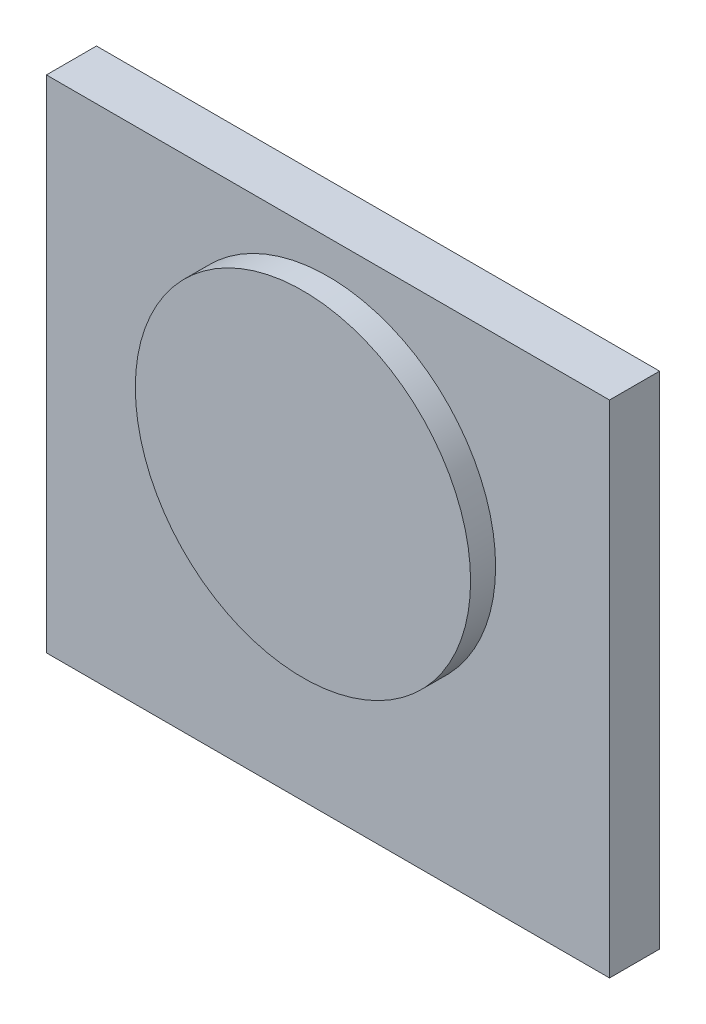
ISO-10303-21;
HEADER;
FILE_DESCRIPTION(('STEP AP214'),'2;1');
FILE_NAME('part.step','',(''),(''),'','','');
FILE_SCHEMA(('AUTOMOTIVE_DESIGN { 1 0 10303 214 1 1 1 1 }'));
ENDSEC;
DATA;
#1=APPLICATION_CONTEXT('core data for automotive mechanical design processes');
#2=APPLICATION_PROTOCOL_DEFINITION('international standard','automotive_design',2000,#1);
#3=PRODUCT_CONTEXT('',#1,'mechanical');
#4=PRODUCT('Part','Part','',(#3));
#5=PRODUCT_RELATED_PRODUCT_CATEGORY('part','',(#4));
#6=PRODUCT_DEFINITION_FORMATION('','',#4);
#7=PRODUCT_DEFINITION_CONTEXT('part definition',#1,'design');
#8=PRODUCT_DEFINITION('design','',#6,#7);
#9=PRODUCT_DEFINITION_SHAPE('','',#8);
#10=(LENGTH_UNIT() NAMED_UNIT(*) SI_UNIT(.MILLI.,.METRE.));
#11=(NAMED_UNIT(*) PLANE_ANGLE_UNIT() SI_UNIT($,.RADIAN.));
#12=(NAMED_UNIT(*) SI_UNIT($,.STERADIAN.) SOLID_ANGLE_UNIT());
#13=UNCERTAINTY_MEASURE_WITH_UNIT(LENGTH_MEASURE(1.E-05),#10,'distance_accuracy_value','');
#14=(GEOMETRIC_REPRESENTATION_CONTEXT(3) GLOBAL_UNCERTAINTY_ASSIGNED_CONTEXT((#13)) GLOBAL_UNIT_ASSIGNED_CONTEXT((#10,
#11,#12)) REPRESENTATION_CONTEXT('',''));
#15=CARTESIAN_POINT('',(0.,0.,0.));
#16=DIRECTION('',(0.,0.,1.));
#17=DIRECTION('',(1.,0.,0.));
#18=AXIS2_PLACEMENT_3D('',#15,#16,#17);
#19=CARTESIAN_POINT('',(230.,69.8959813156576,61.8606367334853));
#20=DIRECTION('',(1.,0.,0.));
#21=DIRECTION('',(0.,0.,-1.));
#22=AXIS2_PLACEMENT_3D('',#19,#20,#21);
#23=PLANE('',#22);
#24=DIRECTION('',(0.,-1.,0.));
#25=VECTOR('',#24,1.);
#26=CARTESIAN_POINT('',(230.,69.8959813156576,57.8606367334853));
#27=LINE('',#26,#25);
#28=CARTESIAN_POINT('',(230.,69.8959813156576,57.8606367334853));
#29=VERTEX_POINT('',#28);
#30=CARTESIAN_POINT('',(230.,29.8959813156576,57.8606367334853));
#31=VERTEX_POINT('',#30);
#32=EDGE_CURVE('E108',#29,#31,#27,.T.);
#33=ORIENTED_EDGE('',*,*,#32,.T.);
#34=DIRECTION('',(0.,0.,-1.));
#35=VECTOR('',#34,1.);
#36=CARTESIAN_POINT('',(230.,29.8959813156576,61.8606367334853));
#37=LINE('',#36,#35);
#38=CARTESIAN_POINT('',(230.,29.8959813156576,61.8606367334853));
#39=VERTEX_POINT('',#38);
#40=EDGE_CURVE('E45',#39,#31,#37,.T.);
#41=ORIENTED_EDGE('',*,*,#40,.F.);
#42=DIRECTION('',(0.,-1.,0.));
#43=VECTOR('',#42,1.);
#44=CARTESIAN_POINT('',(230.,69.8959813156576,61.8606367334853));
#45=LINE('',#44,#43);
#46=CARTESIAN_POINT('',(230.,69.8959813156576,61.8606367334853));
#47=VERTEX_POINT('',#46);
#48=EDGE_CURVE('E95',#47,#39,#45,.T.);
#49=ORIENTED_EDGE('',*,*,#48,.F.);
#50=DIRECTION('',(0.,0.,-1.));
#51=VECTOR('',#50,1.);
#52=CARTESIAN_POINT('',(230.,69.8959813156576,61.8606367334853));
#53=LINE('',#52,#51);
#54=EDGE_CURVE('E104',#47,#29,#53,.T.);
#55=ORIENTED_EDGE('',*,*,#54,.T.);
#56=EDGE_LOOP('',(#33,#41,#49,#55));
#57=FACE_BOUND('',#56,.T.);
#58=ADVANCED_FACE('F42',(#57),#23,.F.);
#59=CARTESIAN_POINT('',(230.,29.8959813156576,61.8606367334853));
#60=DIRECTION('',(0.,1.,0.));
#61=DIRECTION('',(0.,0.,1.));
#62=AXIS2_PLACEMENT_3D('',#59,#60,#61);
#63=PLANE('',#62);
#64=DIRECTION('',(1.,0.,0.));
#65=VECTOR('',#64,1.);
#66=CARTESIAN_POINT('',(230.,29.8959813156576,57.8606367334853));
#67=LINE('',#66,#65);
#68=CARTESIAN_POINT('',(275.,29.8959813156576,57.8606367334853));
#69=VERTEX_POINT('',#68);
#70=EDGE_CURVE('E100',#31,#69,#67,.T.);
#71=ORIENTED_EDGE('',*,*,#70,.T.);
#72=DIRECTION('',(0.,0.,-1.));
#73=VECTOR('',#72,1.);
#74=CARTESIAN_POINT('',(275.,29.8959813156576,61.8606367334853));
#75=LINE('',#74,#73);
#76=CARTESIAN_POINT('',(275.,29.8959813156576,61.8606367334853));
#77=VERTEX_POINT('',#76);
#78=EDGE_CURVE('E98',#77,#69,#75,.T.);
#79=ORIENTED_EDGE('',*,*,#78,.F.);
#80=DIRECTION('',(1.,0.,0.));
#81=VECTOR('',#80,1.);
#82=CARTESIAN_POINT('',(230.,29.8959813156576,61.8606367334853));
#83=LINE('',#82,#81);
#84=EDGE_CURVE('E90',#39,#77,#83,.T.);
#85=ORIENTED_EDGE('',*,*,#84,.F.);
#86=ORIENTED_EDGE('',*,*,#40,.T.);
#87=EDGE_LOOP('',(#71,#79,#85,#86));
#88=FACE_BOUND('',#87,.T.);
#89=ADVANCED_FACE('F99',(#88),#63,.F.);
#90=CARTESIAN_POINT('',(275.,69.8959813156576,61.8606367334853));
#91=DIRECTION('',(-1.,0.,0.));
#92=DIRECTION('',(0.,0.,1.));
#93=AXIS2_PLACEMENT_3D('',#90,#91,#92);
#94=PLANE('',#93);
#95=DIRECTION('',(0.,1.,0.));
#96=VECTOR('',#95,1.);
#97=CARTESIAN_POINT('',(275.,69.8959813156576,57.8606367334853));
#98=LINE('',#97,#96);
#99=CARTESIAN_POINT('',(275.,69.8959813156576,57.8606367334853));
#100=VERTEX_POINT('',#99);
#101=EDGE_CURVE('E76',#69,#100,#98,.T.);
#102=ORIENTED_EDGE('',*,*,#101,.T.);
#103=DIRECTION('',(0.,0.,-1.));
#104=VECTOR('',#103,1.);
#105=CARTESIAN_POINT('',(275.,69.8959813156576,61.8606367334853));
#106=LINE('',#105,#104);
#107=CARTESIAN_POINT('',(275.,69.8959813156576,61.8606367334853));
#108=VERTEX_POINT('',#107);
#109=EDGE_CURVE('E101',#108,#100,#106,.T.);
#110=ORIENTED_EDGE('',*,*,#109,.F.);
#111=DIRECTION('',(0.,1.,0.));
#112=VECTOR('',#111,1.);
#113=CARTESIAN_POINT('',(275.,69.8959813156576,61.8606367334853));
#114=LINE('',#113,#112);
#115=EDGE_CURVE('E93',#77,#108,#114,.T.);
#116=ORIENTED_EDGE('',*,*,#115,.F.);
#117=ORIENTED_EDGE('',*,*,#78,.T.);
#118=EDGE_LOOP('',(#102,#110,#116,#117));
#119=FACE_BOUND('',#118,.T.);
#120=ADVANCED_FACE('F102',(#119),#94,.F.);
#121=CARTESIAN_POINT('',(230.,69.8959813156576,61.8606367334853));
#122=DIRECTION('',(0.,-1.,0.));
#123=DIRECTION('',(0.,0.,-1.));
#124=AXIS2_PLACEMENT_3D('',#121,#122,#123);
#125=PLANE('',#124);
#126=DIRECTION('',(-1.,0.,0.));
#127=VECTOR('',#126,1.);
#128=CARTESIAN_POINT('',(230.,69.8959813156576,57.8606367334853));
#129=LINE('',#128,#127);
#130=EDGE_CURVE('E82',#100,#29,#129,.T.);
#131=ORIENTED_EDGE('',*,*,#130,.T.);
#132=ORIENTED_EDGE('',*,*,#54,.F.);
#133=DIRECTION('',(-1.,0.,0.));
#134=VECTOR('',#133,1.);
#135=CARTESIAN_POINT('',(230.,69.8959813156576,61.8606367334853));
#136=LINE('',#135,#134);
#137=EDGE_CURVE('E59',#108,#47,#136,.T.);
#138=ORIENTED_EDGE('',*,*,#137,.F.);
#139=ORIENTED_EDGE('',*,*,#109,.T.);
#140=EDGE_LOOP('',(#131,#132,#138,#139));
#141=FACE_BOUND('',#140,.T.);
#142=ADVANCED_FACE('F116',(#141),#125,.F.);
#143=CARTESIAN_POINT('',(0.,0.,61.8606367334853));
#144=DIRECTION('',(0.,0.,1.));
#145=DIRECTION('',(1.,0.,0.));
#146=AXIS2_PLACEMENT_3D('',#143,#144,#145);
#147=PLANE('',#146);
#148=CARTESIAN_POINT('',(252.5,53.8161817040583,61.8606367334853));
#149=DIRECTION('',(0.,0.,1.));
#150=DIRECTION('',(1.,0.,0.));
#151=AXIS2_PLACEMENT_3D('',#148,#149,#150);
#152=CIRCLE('',#151,13.3958976626315);
#153=CARTESIAN_POINT('',(265.895897662632,53.8161817040583,61.8606367334853));
#154=VERTEX_POINT('',#153);
#155=EDGE_CURVE('E11',#154,#154,#152,.T.);
#156=ORIENTED_EDGE('',*,*,#155,.F.);
#157=EDGE_LOOP('',(#156));
#158=FACE_BOUND('',#157,.T.);
#159=ORIENTED_EDGE('',*,*,#48,.T.);
#160=ORIENTED_EDGE('',*,*,#84,.T.);
#161=ORIENTED_EDGE('',*,*,#115,.T.);
#162=ORIENTED_EDGE('',*,*,#137,.T.);
#163=EDGE_LOOP('',(#159,#160,#161,#162));
#164=FACE_BOUND('',#163,.T.);
#165=ADVANCED_FACE('F91',(#158,#164),#147,.T.);
#166=CARTESIAN_POINT('',(0.,0.,57.8606367334853));
#167=DIRECTION('',(0.,0.,1.));
#168=DIRECTION('',(1.,0.,0.));
#169=AXIS2_PLACEMENT_3D('',#166,#167,#168);
#170=PLANE('',#169);
#171=ORIENTED_EDGE('',*,*,#32,.F.);
#172=ORIENTED_EDGE('',*,*,#130,.F.);
#173=ORIENTED_EDGE('',*,*,#101,.F.);
#174=ORIENTED_EDGE('',*,*,#70,.F.);
#175=EDGE_LOOP('',(#171,#172,#173,#174));
#176=FACE_BOUND('',#175,.T.);
#177=ADVANCED_FACE('F119',(#176),#170,.F.);
#178=CARTESIAN_POINT('',(252.5,53.8161817040583,63.8606367334853));
#179=DIRECTION('',(0.,0.,-1.));
#180=DIRECTION('',(-1.,0.,0.));
#181=AXIS2_PLACEMENT_3D('',#178,#179,#180);
#182=CYLINDRICAL_SURFACE('',#181,13.3958976626315);
#183=CARTESIAN_POINT('',(252.5,53.8161817040583,63.8606367334853));
#184=DIRECTION('',(0.,0.,1.));
#185=DIRECTION('',(1.,0.,0.));
#186=AXIS2_PLACEMENT_3D('',#183,#184,#185);
#187=CIRCLE('',#186,13.3958976626315);
#188=CARTESIAN_POINT('',(265.895897662632,53.8161817040583,63.8606367334853));
#189=VERTEX_POINT('',#188);
#190=EDGE_CURVE('E111',#189,#189,#187,.T.);
#191=ORIENTED_EDGE('',*,*,#190,.F.);
#192=EDGE_LOOP('',(#191));
#193=FACE_BOUND('',#192,.T.);
#194=ORIENTED_EDGE('',*,*,#155,.T.);
#195=EDGE_LOOP('',(#194));
#196=FACE_BOUND('',#195,.T.);
#197=ADVANCED_FACE('F127',(#193,#196),#182,.T.);
#198=CARTESIAN_POINT('',(252.5,53.8161817040583,63.8606367334853));
#199=DIRECTION('',(0.,0.,1.));
#200=DIRECTION('',(1.,0.,0.));
#201=AXIS2_PLACEMENT_3D('',#198,#199,#200);
#202=PLANE('',#201);
#203=ORIENTED_EDGE('',*,*,#190,.T.);
#204=EDGE_LOOP('',(#203));
#205=FACE_BOUND('',#204,.T.);
#206=ADVANCED_FACE('F125',(#205),#202,.T.);
#207=CLOSED_SHELL('',(#58,#89,#120,#142,#165,#177,#197,#206));
#208=MANIFOLD_SOLID_BREP('B2',#207);
#209=ADVANCED_BREP_SHAPE_REPRESENTATION('',(#18,#208),#14);
#210=SHAPE_DEFINITION_REPRESENTATION(#9,#209);
ENDSEC;
END-ISO-10303-21;
